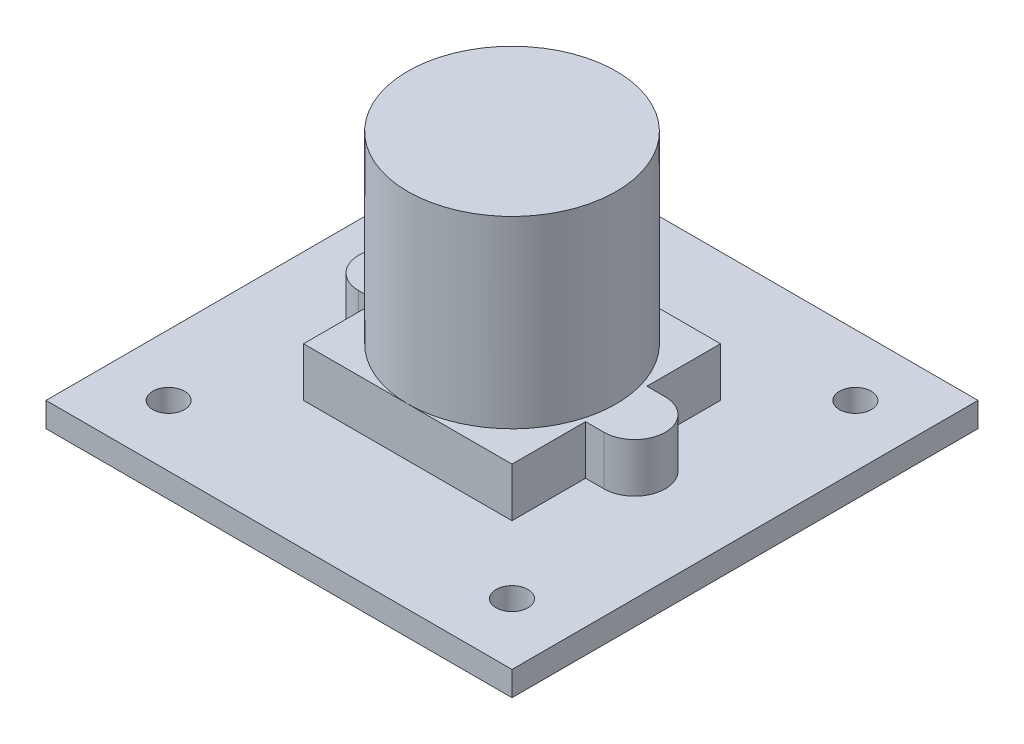
ISO-10303-21;
HEADER;
FILE_DESCRIPTION(('STEP AP214'),'2;1');
FILE_NAME('part.step','',(''),(''),'','','');
FILE_SCHEMA(('AUTOMOTIVE_DESIGN { 1 0 10303 214 1 1 1 1 }'));
ENDSEC;
DATA;
#1=APPLICATION_CONTEXT('core data for automotive mechanical design processes');
#2=APPLICATION_PROTOCOL_DEFINITION('international standard','automotive_design',2000,#1);
#3=PRODUCT_CONTEXT('',#1,'mechanical');
#4=PRODUCT('Part','Part','',(#3));
#5=PRODUCT_RELATED_PRODUCT_CATEGORY('part','',(#4));
#6=PRODUCT_DEFINITION_FORMATION('','',#4);
#7=PRODUCT_DEFINITION_CONTEXT('part definition',#1,'design');
#8=PRODUCT_DEFINITION('design','',#6,#7);
#9=PRODUCT_DEFINITION_SHAPE('','',#8);
#10=(LENGTH_UNIT() NAMED_UNIT(*) SI_UNIT(.MILLI.,.METRE.));
#11=(NAMED_UNIT(*) PLANE_ANGLE_UNIT() SI_UNIT($,.RADIAN.));
#12=(NAMED_UNIT(*) SI_UNIT($,.STERADIAN.) SOLID_ANGLE_UNIT());
#13=UNCERTAINTY_MEASURE_WITH_UNIT(LENGTH_MEASURE(1.E-05),#10,'distance_accuracy_value','');
#14=(GEOMETRIC_REPRESENTATION_CONTEXT(3) GLOBAL_UNCERTAINTY_ASSIGNED_CONTEXT((#13)) GLOBAL_UNIT_ASSIGNED_CONTEXT((#10,
#11,#12)) REPRESENTATION_CONTEXT('',''));
#15=CARTESIAN_POINT('',(0.,0.,0.));
#16=DIRECTION('',(0.,0.,1.));
#17=DIRECTION('',(1.,0.,0.));
#18=AXIS2_PLACEMENT_3D('',#15,#16,#17);
#19=CARTESIAN_POINT('',(0.,2.,0.));
#20=DIRECTION('',(0.,1.,0.));
#21=DIRECTION('',(0.,0.,1.));
#22=AXIS2_PLACEMENT_3D('',#19,#20,#21);
#23=PLANE('',#22);
#24=CARTESIAN_POINT('',(14.,2.,-14.));
#25=DIRECTION('',(0.,1.,0.));
#26=DIRECTION('',(0.,0.,1.));
#27=AXIS2_PLACEMENT_3D('',#24,#25,#26);
#28=CIRCLE('',#27,1.3);
#29=CARTESIAN_POINT('',(14.,2.,-12.7));
#30=VERTEX_POINT('',#29);
#31=EDGE_CURVE('E248',#30,#30,#28,.T.);
#32=ORIENTED_EDGE('',*,*,#31,.F.);
#33=EDGE_LOOP('',(#32));
#34=FACE_BOUND('',#33,.T.);
#35=CARTESIAN_POINT('',(-14.,2.,14.));
#36=DIRECTION('',(0.,1.,0.));
#37=DIRECTION('',(0.,0.,1.));
#38=AXIS2_PLACEMENT_3D('',#35,#36,#37);
#39=CIRCLE('',#38,1.3);
#40=CARTESIAN_POINT('',(-14.,2.,15.3));
#41=VERTEX_POINT('',#40);
#42=EDGE_CURVE('E260',#41,#41,#39,.T.);
#43=ORIENTED_EDGE('',*,*,#42,.F.);
#44=EDGE_LOOP('',(#43));
#45=FACE_BOUND('',#44,.T.);
#46=DIRECTION('',(0.,0.,-1.));
#47=VECTOR('',#46,1.);
#48=CARTESIAN_POINT('',(19.,2.,-19.));
#49=LINE('',#48,#47);
#50=CARTESIAN_POINT('',(19.,2.,19.));
#51=VERTEX_POINT('',#50);
#52=CARTESIAN_POINT('',(19.,2.,-19.));
#53=VERTEX_POINT('',#52);
#54=EDGE_CURVE('E266',#51,#53,#49,.T.);
#55=ORIENTED_EDGE('',*,*,#54,.T.);
#56=DIRECTION('',(-1.,0.,0.));
#57=VECTOR('',#56,1.);
#58=CARTESIAN_POINT('',(-19.,2.,-19.));
#59=LINE('',#58,#57);
#60=CARTESIAN_POINT('',(-19.,2.,-19.));
#61=VERTEX_POINT('',#60);
#62=EDGE_CURVE('E269',#53,#61,#59,.T.);
#63=ORIENTED_EDGE('',*,*,#62,.T.);
#64=DIRECTION('',(0.,0.,1.));
#65=VECTOR('',#64,1.);
#66=CARTESIAN_POINT('',(-19.,2.,-19.));
#67=LINE('',#66,#65);
#68=CARTESIAN_POINT('',(-19.,2.,19.));
#69=VERTEX_POINT('',#68);
#70=EDGE_CURVE('E272',#61,#69,#67,.T.);
#71=ORIENTED_EDGE('',*,*,#70,.T.);
#72=DIRECTION('',(1.,0.,0.));
#73=VECTOR('',#72,1.);
#74=CARTESIAN_POINT('',(-19.,2.,19.));
#75=LINE('',#74,#73);
#76=EDGE_CURVE('E274',#69,#51,#75,.T.);
#77=ORIENTED_EDGE('',*,*,#76,.T.);
#78=EDGE_LOOP('',(#55,#63,#71,#77));
#79=FACE_BOUND('',#78,.T.);
#80=CARTESIAN_POINT('',(-14.,2.,-14.));
#81=DIRECTION('',(0.,1.,0.));
#82=DIRECTION('',(0.,0.,1.));
#83=AXIS2_PLACEMENT_3D('',#80,#81,#82);
#84=CIRCLE('',#83,1.3);
#85=CARTESIAN_POINT('',(-14.,2.,-12.7));
#86=VERTEX_POINT('',#85);
#87=EDGE_CURVE('E254',#86,#86,#84,.T.);
#88=ORIENTED_EDGE('',*,*,#87,.F.);
#89=EDGE_LOOP('',(#88));
#90=FACE_BOUND('',#89,.T.);
#91=CARTESIAN_POINT('',(14.,2.,14.));
#92=DIRECTION('',(0.,1.,0.));
#93=DIRECTION('',(0.,0.,1.));
#94=AXIS2_PLACEMENT_3D('',#91,#92,#93);
#95=CIRCLE('',#94,1.3);
#96=CARTESIAN_POINT('',(14.,2.,15.3));
#97=VERTEX_POINT('',#96);
#98=EDGE_CURVE('E242',#97,#97,#95,.T.);
#99=ORIENTED_EDGE('',*,*,#98,.F.);
#100=EDGE_LOOP('',(#99));
#101=FACE_BOUND('',#100,.T.);
#102=DIRECTION('',(0.,0.,1.));
#103=VECTOR('',#102,1.);
#104=CARTESIAN_POINT('',(-8.5,2.,-8.5));
#105=LINE('',#104,#103);
#106=CARTESIAN_POINT('',(-8.5,2.,2.5));
#107=VERTEX_POINT('',#106);
#108=CARTESIAN_POINT('',(-8.5,2.,8.5));
#109=VERTEX_POINT('',#108);
#110=EDGE_CURVE('E224',#107,#109,#105,.T.);
#111=ORIENTED_EDGE('',*,*,#110,.F.);
#112=DIRECTION('',(1.,0.,0.));
#113=VECTOR('',#112,1.);
#114=CARTESIAN_POINT('',(-10.,2.,2.5));
#115=LINE('',#114,#113);
#116=CARTESIAN_POINT('',(-10.,2.,2.5));
#117=VERTEX_POINT('',#116);
#118=EDGE_CURVE('E190',#117,#107,#115,.T.);
#119=ORIENTED_EDGE('',*,*,#118,.F.);
#120=CARTESIAN_POINT('',(-10.,2.,0.));
#121=DIRECTION('',(0.,1.,0.));
#122=DIRECTION('',(0.,0.,1.));
#123=AXIS2_PLACEMENT_3D('',#120,#121,#122);
#124=CIRCLE('',#123,2.5);
#125=CARTESIAN_POINT('',(-10.,2.,-2.5));
#126=VERTEX_POINT('',#125);
#127=EDGE_CURVE('E182',#126,#117,#124,.T.);
#128=ORIENTED_EDGE('',*,*,#127,.F.);
#129=DIRECTION('',(-1.,0.,0.));
#130=VECTOR('',#129,1.);
#131=CARTESIAN_POINT('',(-10.,2.,-2.5));
#132=LINE('',#131,#130);
#133=CARTESIAN_POINT('',(-8.5,2.,-2.5));
#134=VERTEX_POINT('',#133);
#135=EDGE_CURVE('E164',#134,#126,#132,.T.);
#136=ORIENTED_EDGE('',*,*,#135,.F.);
#137=CARTESIAN_POINT('',(-8.5,2.,-8.5));
#138=VERTEX_POINT('',#137);
#139=EDGE_CURVE('E225',#138,#134,#105,.T.);
#140=ORIENTED_EDGE('',*,*,#139,.F.);
#141=DIRECTION('',(-1.,0.,0.));
#142=VECTOR('',#141,1.);
#143=CARTESIAN_POINT('',(-8.5,2.,-8.5));
#144=LINE('',#143,#142);
#145=CARTESIAN_POINT('',(8.5,2.,-8.5));
#146=VERTEX_POINT('',#145);
#147=EDGE_CURVE('E222',#146,#138,#144,.T.);
#148=ORIENTED_EDGE('',*,*,#147,.F.);
#149=DIRECTION('',(0.,0.,-1.));
#150=VECTOR('',#149,1.);
#151=CARTESIAN_POINT('',(8.5,2.,-8.5));
#152=LINE('',#151,#150);
#153=CARTESIAN_POINT('',(8.5,2.,-2.50000000000001));
#154=VERTEX_POINT('',#153);
#155=EDGE_CURVE('E200',#154,#146,#152,.T.);
#156=ORIENTED_EDGE('',*,*,#155,.F.);
#157=CARTESIAN_POINT('',(10.,2.,-2.50000000000001));
#158=VERTEX_POINT('',#157);
#159=EDGE_CURVE('E320',#158,#154,#132,.T.);
#160=ORIENTED_EDGE('',*,*,#159,.F.);
#161=CARTESIAN_POINT('',(10.,2.,0.));
#162=DIRECTION('',(0.,1.,0.));
#163=DIRECTION('',(0.,0.,1.));
#164=AXIS2_PLACEMENT_3D('',#161,#162,#163);
#165=CIRCLE('',#164,2.5);
#166=CARTESIAN_POINT('',(10.,2.,2.5));
#167=VERTEX_POINT('',#166);
#168=EDGE_CURVE('E161',#167,#158,#165,.T.);
#169=ORIENTED_EDGE('',*,*,#168,.F.);
#170=CARTESIAN_POINT('',(8.5,2.,2.5));
#171=VERTEX_POINT('',#170);
#172=EDGE_CURVE('E188',#171,#167,#115,.T.);
#173=ORIENTED_EDGE('',*,*,#172,.F.);
#174=CARTESIAN_POINT('',(8.5,2.,8.5));
#175=VERTEX_POINT('',#174);
#176=EDGE_CURVE('E219',#175,#171,#152,.T.);
#177=ORIENTED_EDGE('',*,*,#176,.F.);
#178=DIRECTION('',(1.,0.,0.));
#179=VECTOR('',#178,1.);
#180=CARTESIAN_POINT('',(-8.5,2.,8.5));
#181=LINE('',#180,#179);
#182=EDGE_CURVE('E228',#109,#175,#181,.T.);
#183=ORIENTED_EDGE('',*,*,#182,.F.);
#184=EDGE_LOOP('',(#111,#119,#128,#136,#140,#148,#156,#160,#169,#173,#177,#183));
#185=FACE_BOUND('',#184,.T.);
#186=ADVANCED_FACE('F36',(#34,#45,#79,#90,#101,#185),#23,.T.);
#187=CARTESIAN_POINT('',(8.5,6.,-8.5));
#188=DIRECTION('',(-1.,0.,0.));
#189=DIRECTION('',(0.,0.,1.));
#190=AXIS2_PLACEMENT_3D('',#187,#188,#189);
#191=PLANE('',#190);
#192=DIRECTION('',(0.,-1.,0.));
#193=VECTOR('',#192,1.);
#194=CARTESIAN_POINT('',(8.5,6.,2.5));
#195=LINE('',#194,#193);
#196=CARTESIAN_POINT('',(8.5,6.,2.5));
#197=VERTEX_POINT('',#196);
#198=EDGE_CURVE('E178',#197,#171,#195,.T.);
#199=ORIENTED_EDGE('',*,*,#198,.F.);
#200=DIRECTION('',(0.,0.,-1.));
#201=VECTOR('',#200,1.);
#202=CARTESIAN_POINT('',(8.5,6.,-8.5));
#203=LINE('',#202,#201);
#204=CARTESIAN_POINT('',(8.5,6.,8.5));
#205=VERTEX_POINT('',#204);
#206=EDGE_CURVE('E203',#205,#197,#203,.T.);
#207=ORIENTED_EDGE('',*,*,#206,.F.);
#208=DIRECTION('',(0.,-1.,0.));
#209=VECTOR('',#208,1.);
#210=CARTESIAN_POINT('',(8.5,6.,8.5));
#211=LINE('',#210,#209);
#212=EDGE_CURVE('E218',#205,#175,#211,.T.);
#213=ORIENTED_EDGE('',*,*,#212,.T.);
#214=ORIENTED_EDGE('',*,*,#176,.T.);
#215=EDGE_LOOP('',(#199,#207,#213,#214));
#216=FACE_BOUND('',#215,.T.);
#217=ADVANCED_FACE('F347',(#216),#191,.F.);
#218=DIRECTION('',(0.,1.,0.));
#219=VECTOR('',#218,1.);
#220=CARTESIAN_POINT('',(8.5,6.,-2.50000000000001));
#221=LINE('',#220,#219);
#222=CARTESIAN_POINT('',(8.5,6.,-2.50000000000001));
#223=VERTEX_POINT('',#222);
#224=EDGE_CURVE('E168',#154,#223,#221,.T.);
#225=ORIENTED_EDGE('',*,*,#224,.F.);
#226=ORIENTED_EDGE('',*,*,#155,.T.);
#227=DIRECTION('',(0.,-1.,0.));
#228=VECTOR('',#227,1.);
#229=CARTESIAN_POINT('',(8.5,6.,-8.5));
#230=LINE('',#229,#228);
#231=CARTESIAN_POINT('',(8.5,6.,-8.5));
#232=VERTEX_POINT('',#231);
#233=EDGE_CURVE('E238',#232,#146,#230,.T.);
#234=ORIENTED_EDGE('',*,*,#233,.F.);
#235=EDGE_CURVE('E206',#223,#232,#203,.T.);
#236=ORIENTED_EDGE('',*,*,#235,.F.);
#237=EDGE_LOOP('',(#225,#226,#234,#236));
#238=FACE_BOUND('',#237,.T.);
#239=ADVANCED_FACE('F316',(#238),#191,.F.);
#240=CARTESIAN_POINT('',(-8.5,6.,-8.5));
#241=DIRECTION('',(1.,0.,0.));
#242=DIRECTION('',(0.,0.,-1.));
#243=AXIS2_PLACEMENT_3D('',#240,#241,#242);
#244=PLANE('',#243);
#245=DIRECTION('',(0.,1.,0.));
#246=VECTOR('',#245,1.);
#247=CARTESIAN_POINT('',(-8.5,6.,2.5));
#248=LINE('',#247,#246);
#249=CARTESIAN_POINT('',(-8.5,6.,2.5));
#250=VERTEX_POINT('',#249);
#251=EDGE_CURVE('E176',#107,#250,#248,.T.);
#252=ORIENTED_EDGE('',*,*,#251,.F.);
#253=ORIENTED_EDGE('',*,*,#110,.T.);
#254=DIRECTION('',(0.,-1.,0.));
#255=VECTOR('',#254,1.);
#256=CARTESIAN_POINT('',(-8.5,6.,8.5));
#257=LINE('',#256,#255);
#258=CARTESIAN_POINT('',(-8.5,6.,8.5));
#259=VERTEX_POINT('',#258);
#260=EDGE_CURVE('E232',#259,#109,#257,.T.);
#261=ORIENTED_EDGE('',*,*,#260,.F.);
#262=DIRECTION('',(0.,0.,1.));
#263=VECTOR('',#262,1.);
#264=CARTESIAN_POINT('',(-8.5,6.,-8.5));
#265=LINE('',#264,#263);
#266=EDGE_CURVE('E210',#250,#259,#265,.T.);
#267=ORIENTED_EDGE('',*,*,#266,.F.);
#268=EDGE_LOOP('',(#252,#253,#261,#267));
#269=FACE_BOUND('',#268,.T.);
#270=ADVANCED_FACE('F341',(#269),#244,.F.);
#271=DIRECTION('',(0.,-1.,0.));
#272=VECTOR('',#271,1.);
#273=CARTESIAN_POINT('',(-8.5,6.,-2.5));
#274=LINE('',#273,#272);
#275=CARTESIAN_POINT('',(-8.5,6.,-2.5));
#276=VERTEX_POINT('',#275);
#277=EDGE_CURVE('E11',#276,#134,#274,.T.);
#278=ORIENTED_EDGE('',*,*,#277,.F.);
#279=CARTESIAN_POINT('',(-8.5,6.,-8.5));
#280=VERTEX_POINT('',#279);
#281=EDGE_CURVE('E211',#280,#276,#265,.T.);
#282=ORIENTED_EDGE('',*,*,#281,.F.);
#283=DIRECTION('',(0.,-1.,0.));
#284=VECTOR('',#283,1.);
#285=CARTESIAN_POINT('',(-8.5,6.,-8.5));
#286=LINE('',#285,#284);
#287=EDGE_CURVE('E235',#280,#138,#286,.T.);
#288=ORIENTED_EDGE('',*,*,#287,.T.);
#289=ORIENTED_EDGE('',*,*,#139,.T.);
#290=EDGE_LOOP('',(#278,#282,#288,#289));
#291=FACE_BOUND('',#290,.T.);
#292=ADVANCED_FACE('F326',(#291),#244,.F.);
#293=CARTESIAN_POINT('',(0.,6.,0.));
#294=DIRECTION('',(0.,1.,0.));
#295=DIRECTION('',(0.,0.,1.));
#296=AXIS2_PLACEMENT_3D('',#293,#294,#295);
#297=PLANE('',#296);
#298=DIRECTION('',(-1.,0.,0.));
#299=VECTOR('',#298,1.);
#300=CARTESIAN_POINT('',(-10.,6.,-2.5));
#301=LINE('',#300,#299);
#302=CARTESIAN_POINT('',(10.,6.,-2.50000000000001));
#303=VERTEX_POINT('',#302);
#304=EDGE_CURVE('E51',#303,#223,#301,.T.);
#305=ORIENTED_EDGE('',*,*,#304,.T.);
#306=ORIENTED_EDGE('',*,*,#235,.T.);
#307=DIRECTION('',(-1.,0.,0.));
#308=VECTOR('',#307,1.);
#309=CARTESIAN_POINT('',(-8.5,6.,-8.5));
#310=LINE('',#309,#308);
#311=CARTESIAN_POINT('',(0.,6.,-8.5));
#312=VERTEX_POINT('',#311);
#313=EDGE_CURVE('E207',#232,#312,#310,.T.);
#314=ORIENTED_EDGE('',*,*,#313,.T.);
#315=CARTESIAN_POINT('',(0.,6.,0.));
#316=DIRECTION('',(0.,1.,0.));
#317=DIRECTION('',(0.,0.,1.));
#318=AXIS2_PLACEMENT_3D('',#315,#316,#317);
#319=CIRCLE('',#318,8.5);
#320=CARTESIAN_POINT('',(0.,6.,8.5));
#321=VERTEX_POINT('',#320);
#322=EDGE_CURVE('E44',#321,#312,#319,.T.);
#323=ORIENTED_EDGE('',*,*,#322,.F.);
#324=DIRECTION('',(1.,0.,0.));
#325=VECTOR('',#324,1.);
#326=CARTESIAN_POINT('',(-8.5,6.,8.5));
#327=LINE('',#326,#325);
#328=EDGE_CURVE('E214',#321,#205,#327,.T.);
#329=ORIENTED_EDGE('',*,*,#328,.T.);
#330=ORIENTED_EDGE('',*,*,#206,.T.);
#331=DIRECTION('',(1.,0.,0.));
#332=VECTOR('',#331,1.);
#333=CARTESIAN_POINT('',(-10.,6.,2.5));
#334=LINE('',#333,#332);
#335=CARTESIAN_POINT('',(10.,6.,2.5));
#336=VERTEX_POINT('',#335);
#337=EDGE_CURVE('E175',#197,#336,#334,.T.);
#338=ORIENTED_EDGE('',*,*,#337,.T.);
#339=CARTESIAN_POINT('',(10.,6.,0.));
#340=DIRECTION('',(0.,1.,0.));
#341=DIRECTION('',(0.,0.,1.));
#342=AXIS2_PLACEMENT_3D('',#339,#340,#341);
#343=CIRCLE('',#342,2.5);
#344=EDGE_CURVE('E158',#336,#303,#343,.T.);
#345=ORIENTED_EDGE('',*,*,#344,.T.);
#346=EDGE_LOOP('',(#305,#306,#314,#323,#329,#330,#338,#345));
#347=FACE_BOUND('',#346,.T.);
#348=ADVANCED_FACE('F173',(#347),#297,.T.);
#349=CARTESIAN_POINT('',(0.,0.,0.));
#350=DIRECTION('',(0.,1.,0.));
#351=DIRECTION('',(0.,0.,1.));
#352=AXIS2_PLACEMENT_3D('',#349,#350,#351);
#353=PLANE('',#352);
#354=DIRECTION('',(0.,0.,-1.));
#355=VECTOR('',#354,1.);
#356=CARTESIAN_POINT('',(19.,0.,-19.));
#357=LINE('',#356,#355);
#358=CARTESIAN_POINT('',(19.,0.,19.));
#359=VERTEX_POINT('',#358);
#360=CARTESIAN_POINT('',(19.,0.,-19.));
#361=VERTEX_POINT('',#360);
#362=EDGE_CURVE('E263',#359,#361,#357,.T.);
#363=ORIENTED_EDGE('',*,*,#362,.F.);
#364=DIRECTION('',(1.,0.,0.));
#365=VECTOR('',#364,1.);
#366=CARTESIAN_POINT('',(-19.,0.,19.));
#367=LINE('',#366,#365);
#368=CARTESIAN_POINT('',(-19.,0.,19.));
#369=VERTEX_POINT('',#368);
#370=EDGE_CURVE('E270',#369,#359,#367,.T.);
#371=ORIENTED_EDGE('',*,*,#370,.F.);
#372=DIRECTION('',(0.,0.,1.));
#373=VECTOR('',#372,1.);
#374=CARTESIAN_POINT('',(-19.,0.,-19.));
#375=LINE('',#374,#373);
#376=CARTESIAN_POINT('',(-19.,0.,-19.));
#377=VERTEX_POINT('',#376);
#378=EDGE_CURVE('E281',#377,#369,#375,.T.);
#379=ORIENTED_EDGE('',*,*,#378,.F.);
#380=DIRECTION('',(-1.,0.,0.));
#381=VECTOR('',#380,1.);
#382=CARTESIAN_POINT('',(-19.,0.,-19.));
#383=LINE('',#382,#381);
#384=EDGE_CURVE('E279',#361,#377,#383,.T.);
#385=ORIENTED_EDGE('',*,*,#384,.F.);
#386=EDGE_LOOP('',(#363,#371,#379,#385));
#387=FACE_BOUND('',#386,.T.);
#388=CARTESIAN_POINT('',(-14.,0.,14.));
#389=DIRECTION('',(0.,1.,0.));
#390=DIRECTION('',(0.,0.,1.));
#391=AXIS2_PLACEMENT_3D('',#388,#389,#390);
#392=CIRCLE('',#391,1.3);
#393=CARTESIAN_POINT('',(-14.,0.,15.3));
#394=VERTEX_POINT('',#393);
#395=EDGE_CURVE('E257',#394,#394,#392,.T.);
#396=ORIENTED_EDGE('',*,*,#395,.T.);
#397=EDGE_LOOP('',(#396));
#398=FACE_BOUND('',#397,.T.);
#399=CARTESIAN_POINT('',(-14.,0.,-14.));
#400=DIRECTION('',(0.,1.,0.));
#401=DIRECTION('',(0.,0.,1.));
#402=AXIS2_PLACEMENT_3D('',#399,#400,#401);
#403=CIRCLE('',#402,1.3);
#404=CARTESIAN_POINT('',(-14.,0.,-12.7));
#405=VERTEX_POINT('',#404);
#406=EDGE_CURVE('E251',#405,#405,#403,.T.);
#407=ORIENTED_EDGE('',*,*,#406,.T.);
#408=EDGE_LOOP('',(#407));
#409=FACE_BOUND('',#408,.T.);
#410=CARTESIAN_POINT('',(14.,0.,-14.));
#411=DIRECTION('',(0.,1.,0.));
#412=DIRECTION('',(0.,0.,1.));
#413=AXIS2_PLACEMENT_3D('',#410,#411,#412);
#414=CIRCLE('',#413,1.3);
#415=CARTESIAN_POINT('',(14.,0.,-12.7));
#416=VERTEX_POINT('',#415);
#417=EDGE_CURVE('E245',#416,#416,#414,.T.);
#418=ORIENTED_EDGE('',*,*,#417,.T.);
#419=EDGE_LOOP('',(#418));
#420=FACE_BOUND('',#419,.T.);
#421=CARTESIAN_POINT('',(14.,0.,14.));
#422=DIRECTION('',(0.,1.,0.));
#423=DIRECTION('',(0.,0.,1.));
#424=AXIS2_PLACEMENT_3D('',#421,#422,#423);
#425=CIRCLE('',#424,1.3);
#426=CARTESIAN_POINT('',(14.,0.,15.3));
#427=VERTEX_POINT('',#426);
#428=EDGE_CURVE('E241',#427,#427,#425,.T.);
#429=ORIENTED_EDGE('',*,*,#428,.T.);
#430=EDGE_LOOP('',(#429));
#431=FACE_BOUND('',#430,.T.);
#432=ADVANCED_FACE('F375',(#387,#398,#409,#420,#431),#353,.F.);
#433=CARTESIAN_POINT('',(19.,2.,-19.));
#434=DIRECTION('',(-1.,0.,0.));
#435=DIRECTION('',(0.,0.,1.));
#436=AXIS2_PLACEMENT_3D('',#433,#434,#435);
#437=PLANE('',#436);
#438=ORIENTED_EDGE('',*,*,#362,.T.);
#439=DIRECTION('',(0.,-1.,0.));
#440=VECTOR('',#439,1.);
#441=CARTESIAN_POINT('',(19.,2.,-19.));
#442=LINE('',#441,#440);
#443=EDGE_CURVE('E291',#53,#361,#442,.T.);
#444=ORIENTED_EDGE('',*,*,#443,.F.);
#445=ORIENTED_EDGE('',*,*,#54,.F.);
#446=DIRECTION('',(0.,-1.,0.));
#447=VECTOR('',#446,1.);
#448=CARTESIAN_POINT('',(19.,2.,19.));
#449=LINE('',#448,#447);
#450=EDGE_CURVE('E276',#51,#359,#449,.T.);
#451=ORIENTED_EDGE('',*,*,#450,.T.);
#452=EDGE_LOOP('',(#438,#444,#445,#451));
#453=FACE_BOUND('',#452,.T.);
#454=ADVANCED_FACE('F38',(#453),#437,.F.);
#455=CARTESIAN_POINT('',(-19.,2.,-19.));
#456=DIRECTION('',(0.,0.,1.));
#457=DIRECTION('',(1.,0.,0.));
#458=AXIS2_PLACEMENT_3D('',#455,#456,#457);
#459=PLANE('',#458);
#460=ORIENTED_EDGE('',*,*,#384,.T.);
#461=DIRECTION('',(0.,-1.,0.));
#462=VECTOR('',#461,1.);
#463=CARTESIAN_POINT('',(-19.,2.,-19.));
#464=LINE('',#463,#462);
#465=EDGE_CURVE('E289',#61,#377,#464,.T.);
#466=ORIENTED_EDGE('',*,*,#465,.F.);
#467=ORIENTED_EDGE('',*,*,#62,.F.);
#468=ORIENTED_EDGE('',*,*,#443,.T.);
#469=EDGE_LOOP('',(#460,#466,#467,#468));
#470=FACE_BOUND('',#469,.T.);
#471=ADVANCED_FACE('F385',(#470),#459,.F.);
#472=CARTESIAN_POINT('',(-19.,2.,-19.));
#473=DIRECTION('',(1.,0.,0.));
#474=DIRECTION('',(0.,0.,-1.));
#475=AXIS2_PLACEMENT_3D('',#472,#473,#474);
#476=PLANE('',#475);
#477=ORIENTED_EDGE('',*,*,#378,.T.);
#478=DIRECTION('',(0.,-1.,0.));
#479=VECTOR('',#478,1.);
#480=CARTESIAN_POINT('',(-19.,2.,19.));
#481=LINE('',#480,#479);
#482=EDGE_CURVE('E286',#69,#369,#481,.T.);
#483=ORIENTED_EDGE('',*,*,#482,.F.);
#484=ORIENTED_EDGE('',*,*,#70,.F.);
#485=ORIENTED_EDGE('',*,*,#465,.T.);
#486=EDGE_LOOP('',(#477,#483,#484,#485));
#487=FACE_BOUND('',#486,.T.);
#488=ADVANCED_FACE('F382',(#487),#476,.F.);
#489=CARTESIAN_POINT('',(-19.,2.,19.));
#490=DIRECTION('',(0.,0.,-1.));
#491=DIRECTION('',(-1.,0.,0.));
#492=AXIS2_PLACEMENT_3D('',#489,#490,#491);
#493=PLANE('',#492);
#494=ORIENTED_EDGE('',*,*,#370,.T.);
#495=ORIENTED_EDGE('',*,*,#450,.F.);
#496=ORIENTED_EDGE('',*,*,#76,.F.);
#497=ORIENTED_EDGE('',*,*,#482,.T.);
#498=EDGE_LOOP('',(#494,#495,#496,#497));
#499=FACE_BOUND('',#498,.T.);
#500=ADVANCED_FACE('F379',(#499),#493,.F.);
#501=CARTESIAN_POINT('',(-14.,2.,14.));
#502=DIRECTION('',(0.,-1.,0.));
#503=DIRECTION('',(0.,0.,-1.));
#504=AXIS2_PLACEMENT_3D('',#501,#502,#503);
#505=CYLINDRICAL_SURFACE('',#504,1.3);
#506=ORIENTED_EDGE('',*,*,#42,.T.);
#507=EDGE_LOOP('',(#506));
#508=FACE_BOUND('',#507,.T.);
#509=ORIENTED_EDGE('',*,*,#395,.F.);
#510=EDGE_LOOP('',(#509));
#511=FACE_BOUND('',#510,.T.);
#512=ADVANCED_FACE('F373',(#508,#511),#505,.F.);
#513=CARTESIAN_POINT('',(-14.,2.,-14.));
#514=DIRECTION('',(0.,-1.,0.));
#515=DIRECTION('',(0.,0.,-1.));
#516=AXIS2_PLACEMENT_3D('',#513,#514,#515);
#517=CYLINDRICAL_SURFACE('',#516,1.3);
#518=ORIENTED_EDGE('',*,*,#87,.T.);
#519=EDGE_LOOP('',(#518));
#520=FACE_BOUND('',#519,.T.);
#521=ORIENTED_EDGE('',*,*,#406,.F.);
#522=EDGE_LOOP('',(#521));
#523=FACE_BOUND('',#522,.T.);
#524=ADVANCED_FACE('F420',(#520,#523),#517,.F.);
#525=CARTESIAN_POINT('',(14.,2.,-14.));
#526=DIRECTION('',(0.,-1.,0.));
#527=DIRECTION('',(0.,0.,-1.));
#528=AXIS2_PLACEMENT_3D('',#525,#526,#527);
#529=CYLINDRICAL_SURFACE('',#528,1.3);
#530=ORIENTED_EDGE('',*,*,#31,.T.);
#531=EDGE_LOOP('',(#530));
#532=FACE_BOUND('',#531,.T.);
#533=ORIENTED_EDGE('',*,*,#417,.F.);
#534=EDGE_LOOP('',(#533));
#535=FACE_BOUND('',#534,.T.);
#536=ADVANCED_FACE('F411',(#532,#535),#529,.F.);
#537=CARTESIAN_POINT('',(14.,2.,14.));
#538=DIRECTION('',(0.,-1.,0.));
#539=DIRECTION('',(0.,0.,-1.));
#540=AXIS2_PLACEMENT_3D('',#537,#538,#539);
#541=CYLINDRICAL_SURFACE('',#540,1.3);
#542=ORIENTED_EDGE('',*,*,#98,.T.);
#543=EDGE_LOOP('',(#542));
#544=FACE_BOUND('',#543,.T.);
#545=ORIENTED_EDGE('',*,*,#428,.F.);
#546=EDGE_LOOP('',(#545));
#547=FACE_BOUND('',#546,.T.);
#548=ADVANCED_FACE('F408',(#544,#547),#541,.F.);
#549=CARTESIAN_POINT('',(-8.5,6.,-8.5));
#550=DIRECTION('',(0.,0.,1.));
#551=DIRECTION('',(1.,0.,0.));
#552=AXIS2_PLACEMENT_3D('',#549,#550,#551);
#553=PLANE('',#552);
#554=ORIENTED_EDGE('',*,*,#147,.T.);
#555=ORIENTED_EDGE('',*,*,#287,.F.);
#556=EDGE_CURVE('E205',#312,#280,#310,.T.);
#557=ORIENTED_EDGE('',*,*,#556,.F.);
#558=ORIENTED_EDGE('',*,*,#313,.F.);
#559=ORIENTED_EDGE('',*,*,#233,.T.);
#560=EDGE_LOOP('',(#554,#555,#557,#558,#559));
#561=FACE_BOUND('',#560,.T.);
#562=ADVANCED_FACE('F312',(#561),#553,.F.);
#563=CARTESIAN_POINT('',(-8.5,6.,8.5));
#564=DIRECTION('',(0.,0.,-1.));
#565=DIRECTION('',(-1.,0.,0.));
#566=AXIS2_PLACEMENT_3D('',#563,#564,#565);
#567=PLANE('',#566);
#568=ORIENTED_EDGE('',*,*,#182,.T.);
#569=ORIENTED_EDGE('',*,*,#212,.F.);
#570=ORIENTED_EDGE('',*,*,#328,.F.);
#571=EDGE_CURVE('E215',#259,#321,#327,.T.);
#572=ORIENTED_EDGE('',*,*,#571,.F.);
#573=ORIENTED_EDGE('',*,*,#260,.T.);
#574=EDGE_LOOP('',(#568,#569,#570,#572,#573));
#575=FACE_BOUND('',#574,.T.);
#576=ADVANCED_FACE('F307',(#575),#567,.F.);
#577=EDGE_CURVE('E202',#312,#321,#319,.T.);
#578=ORIENTED_EDGE('',*,*,#577,.F.);
#579=ORIENTED_EDGE('',*,*,#556,.T.);
#580=ORIENTED_EDGE('',*,*,#281,.T.);
#581=CARTESIAN_POINT('',(-10.,6.,-2.5));
#582=VERTEX_POINT('',#581);
#583=EDGE_CURVE('E171',#276,#582,#301,.T.);
#584=ORIENTED_EDGE('',*,*,#583,.T.);
#585=CARTESIAN_POINT('',(-10.,6.,0.));
#586=DIRECTION('',(0.,1.,0.));
#587=DIRECTION('',(0.,0.,1.));
#588=AXIS2_PLACEMENT_3D('',#585,#586,#587);
#589=CIRCLE('',#588,2.5);
#590=CARTESIAN_POINT('',(-10.,6.,2.5));
#591=VERTEX_POINT('',#590);
#592=EDGE_CURVE('E170',#582,#591,#589,.T.);
#593=ORIENTED_EDGE('',*,*,#592,.T.);
#594=EDGE_CURVE('E59',#591,#250,#334,.T.);
#595=ORIENTED_EDGE('',*,*,#594,.T.);
#596=ORIENTED_EDGE('',*,*,#266,.T.);
#597=ORIENTED_EDGE('',*,*,#571,.T.);
#598=EDGE_LOOP('',(#578,#579,#580,#584,#593,#595,#596,#597));
#599=FACE_BOUND('',#598,.T.);
#600=ADVANCED_FACE('F302',(#599),#297,.T.);
#601=CARTESIAN_POINT('',(0.,21.,0.));
#602=DIRECTION('',(0.,-1.,0.));
#603=DIRECTION('',(0.,0.,-1.));
#604=AXIS2_PLACEMENT_3D('',#601,#602,#603);
#605=CYLINDRICAL_SURFACE('',#604,8.5);
#606=CARTESIAN_POINT('',(0.,21.,0.));
#607=DIRECTION('',(0.,1.,0.));
#608=DIRECTION('',(0.,0.,1.));
#609=AXIS2_PLACEMENT_3D('',#606,#607,#608);
#610=CIRCLE('',#609,8.5);
#611=CARTESIAN_POINT('',(0.,21.,8.5));
#612=VERTEX_POINT('',#611);
#613=EDGE_CURVE('E197',#612,#612,#610,.T.);
#614=ORIENTED_EDGE('',*,*,#613,.F.);
#615=EDGE_LOOP('',(#614));
#616=FACE_BOUND('',#615,.T.);
#617=ORIENTED_EDGE('',*,*,#577,.T.);
#618=ORIENTED_EDGE('',*,*,#322,.T.);
#619=EDGE_LOOP('',(#617,#618));
#620=FACE_BOUND('',#619,.T.);
#621=ADVANCED_FACE('F298',(#616,#620),#605,.T.);
#622=CARTESIAN_POINT('',(0.,21.,0.));
#623=DIRECTION('',(0.,1.,0.));
#624=DIRECTION('',(0.,0.,1.));
#625=AXIS2_PLACEMENT_3D('',#622,#623,#624);
#626=PLANE('',#625);
#627=ORIENTED_EDGE('',*,*,#613,.T.);
#628=EDGE_LOOP('',(#627));
#629=FACE_BOUND('',#628,.T.);
#630=ADVANCED_FACE('F502',(#629),#626,.T.);
#631=CARTESIAN_POINT('',(-10.,31.4950975679639,-2.5));
#632=DIRECTION('',(0.,0.,1.));
#633=DIRECTION('',(1.,0.,0.));
#634=AXIS2_PLACEMENT_3D('',#631,#632,#633);
#635=PLANE('',#634);
#636=ORIENTED_EDGE('',*,*,#583,.F.);
#637=ORIENTED_EDGE('',*,*,#277,.T.);
#638=ORIENTED_EDGE('',*,*,#135,.T.);
#639=DIRECTION('',(0.,-1.,0.));
#640=VECTOR('',#639,1.);
#641=CARTESIAN_POINT('',(-10.,31.4950975679639,-2.5));
#642=LINE('',#641,#640);
#643=EDGE_CURVE('E192',#582,#126,#642,.T.);
#644=ORIENTED_EDGE('',*,*,#643,.F.);
#645=EDGE_LOOP('',(#636,#637,#638,#644));
#646=FACE_BOUND('',#645,.T.);
#647=ADVANCED_FACE('F330',(#646),#635,.F.);
#648=CARTESIAN_POINT('',(-10.,31.4950975679639,2.5));
#649=DIRECTION('',(0.,0.,-1.));
#650=DIRECTION('',(-1.,0.,0.));
#651=AXIS2_PLACEMENT_3D('',#648,#649,#650);
#652=PLANE('',#651);
#653=ORIENTED_EDGE('',*,*,#118,.T.);
#654=ORIENTED_EDGE('',*,*,#251,.T.);
#655=ORIENTED_EDGE('',*,*,#594,.F.);
#656=DIRECTION('',(0.,-1.,0.));
#657=VECTOR('',#656,1.);
#658=CARTESIAN_POINT('',(-10.,31.4950975679639,2.5));
#659=LINE('',#658,#657);
#660=EDGE_CURVE('E186',#591,#117,#659,.T.);
#661=ORIENTED_EDGE('',*,*,#660,.T.);
#662=EDGE_LOOP('',(#653,#654,#655,#661));
#663=FACE_BOUND('',#662,.T.);
#664=ADVANCED_FACE('F338',(#663),#652,.F.);
#665=CARTESIAN_POINT('',(-10.,31.4950975679639,0.));
#666=DIRECTION('',(0.,-1.,0.));
#667=DIRECTION('',(0.,0.,-1.));
#668=AXIS2_PLACEMENT_3D('',#665,#666,#667);
#669=CYLINDRICAL_SURFACE('',#668,2.5);
#670=ORIENTED_EDGE('',*,*,#592,.F.);
#671=ORIENTED_EDGE('',*,*,#643,.T.);
#672=ORIENTED_EDGE('',*,*,#127,.T.);
#673=ORIENTED_EDGE('',*,*,#660,.F.);
#674=EDGE_LOOP('',(#670,#671,#672,#673));
#675=FACE_BOUND('',#674,.T.);
#676=ADVANCED_FACE('F335',(#675),#669,.T.);
#677=ORIENTED_EDGE('',*,*,#159,.T.);
#678=ORIENTED_EDGE('',*,*,#224,.T.);
#679=ORIENTED_EDGE('',*,*,#304,.F.);
#680=DIRECTION('',(0.,-1.,0.));
#681=VECTOR('',#680,1.);
#682=CARTESIAN_POINT('',(10.,31.4950975679639,-2.50000000000001));
#683=LINE('',#682,#681);
#684=EDGE_CURVE('E155',#303,#158,#683,.T.);
#685=ORIENTED_EDGE('',*,*,#684,.T.);
#686=EDGE_LOOP('',(#677,#678,#679,#685));
#687=FACE_BOUND('',#686,.T.);
#688=ADVANCED_FACE('F166',(#687),#635,.F.);
#689=ORIENTED_EDGE('',*,*,#337,.F.);
#690=ORIENTED_EDGE('',*,*,#198,.T.);
#691=ORIENTED_EDGE('',*,*,#172,.T.);
#692=DIRECTION('',(0.,-1.,0.));
#693=VECTOR('',#692,1.);
#694=CARTESIAN_POINT('',(10.,31.4950975679639,2.5));
#695=LINE('',#694,#693);
#696=EDGE_CURVE('E189',#336,#167,#695,.T.);
#697=ORIENTED_EDGE('',*,*,#696,.F.);
#698=EDGE_LOOP('',(#689,#690,#691,#697));
#699=FACE_BOUND('',#698,.T.);
#700=ADVANCED_FACE('F349',(#699),#652,.F.);
#701=CARTESIAN_POINT('',(10.,31.4950975679639,0.));
#702=DIRECTION('',(0.,-1.,0.));
#703=DIRECTION('',(0.,0.,-1.));
#704=AXIS2_PLACEMENT_3D('',#701,#702,#703);
#705=CYLINDRICAL_SURFACE('',#704,2.5);
#706=ORIENTED_EDGE('',*,*,#344,.F.);
#707=ORIENTED_EDGE('',*,*,#696,.T.);
#708=ORIENTED_EDGE('',*,*,#168,.T.);
#709=ORIENTED_EDGE('',*,*,#684,.F.);
#710=EDGE_LOOP('',(#706,#707,#708,#709));
#711=FACE_BOUND('',#710,.T.);
#712=ADVANCED_FACE('F156',(#711),#705,.T.);
#713=CLOSED_SHELL('',(#186,#217,#239,#270,#292,#348,#432,#454,#471,#488,#500,#512,#524,#536,
#548,#562,#576,#600,#621,#630,#647,#664,#676,#688,#700,#712));
#714=MANIFOLD_SOLID_BREP('B2',#713);
#715=ADVANCED_BREP_SHAPE_REPRESENTATION('',(#18,#714),#14);
#716=SHAPE_DEFINITION_REPRESENTATION(#9,#715);
ENDSEC;
END-ISO-10303-21;
